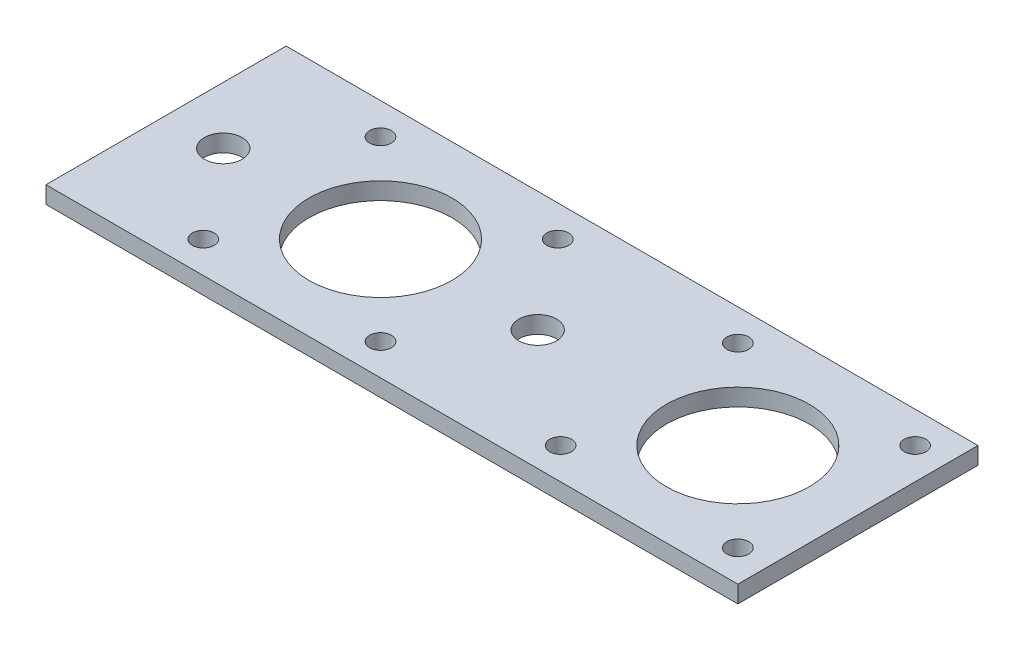
ISO-10303-21;
HEADER;
FILE_DESCRIPTION(('STEP AP214'),'2;1');
FILE_NAME('part.step','',(''),(''),'','','');
FILE_SCHEMA(('AUTOMOTIVE_DESIGN { 1 0 10303 214 1 1 1 1 }'));
ENDSEC;
DATA;
#1=APPLICATION_CONTEXT('core data for automotive mechanical design processes');
#2=APPLICATION_PROTOCOL_DEFINITION('international standard','automotive_design',2000,#1);
#3=PRODUCT_CONTEXT('',#1,'mechanical');
#4=PRODUCT('Part','Part','',(#3));
#5=PRODUCT_RELATED_PRODUCT_CATEGORY('part','',(#4));
#6=PRODUCT_DEFINITION_FORMATION('','',#4);
#7=PRODUCT_DEFINITION_CONTEXT('part definition',#1,'design');
#8=PRODUCT_DEFINITION('design','',#6,#7);
#9=PRODUCT_DEFINITION_SHAPE('','',#8);
#10=(LENGTH_UNIT() NAMED_UNIT(*) SI_UNIT(.MILLI.,.METRE.));
#11=(NAMED_UNIT(*) PLANE_ANGLE_UNIT() SI_UNIT($,.RADIAN.));
#12=(NAMED_UNIT(*) SI_UNIT($,.STERADIAN.) SOLID_ANGLE_UNIT());
#13=UNCERTAINTY_MEASURE_WITH_UNIT(LENGTH_MEASURE(1.E-05),#10,'distance_accuracy_value','');
#14=(GEOMETRIC_REPRESENTATION_CONTEXT(3) GLOBAL_UNCERTAINTY_ASSIGNED_CONTEXT((#13)) GLOBAL_UNIT_ASSIGNED_CONTEXT((#10,
#11,#12)) REPRESENTATION_CONTEXT('',''));
#15=CARTESIAN_POINT('',(0.,0.,0.));
#16=DIRECTION('',(0.,0.,1.));
#17=DIRECTION('',(1.,0.,0.));
#18=AXIS2_PLACEMENT_3D('',#15,#16,#17);
#19=CARTESIAN_POINT('',(0.,3.,0.));
#20=DIRECTION('',(0.,-1.,0.));
#21=DIRECTION('',(0.,0.,-1.));
#22=AXIS2_PLACEMENT_3D('',#19,#20,#21);
#23=PLANE('',#22);
#24=CARTESIAN_POINT('',(84.5,3.,-36.5));
#25=DIRECTION('',(0.,1.,0.));
#26=DIRECTION('',(0.,0.,1.));
#27=AXIS2_PLACEMENT_3D('',#24,#25,#26);
#28=CIRCLE('',#27,1.90000000000001);
#29=CARTESIAN_POINT('',(84.5,3.,-34.6));
#30=VERTEX_POINT('',#29);
#31=EDGE_CURVE('E240',#30,#30,#28,.T.);
#32=ORIENTED_EDGE('',*,*,#31,.F.);
#33=EDGE_LOOP('',(#32));
#34=FACE_BOUND('',#33,.T.);
#35=CARTESIAN_POINT('',(115.5,3.,-36.5));
#36=DIRECTION('',(0.,1.,0.));
#37=DIRECTION('',(0.,0.,1.));
#38=AXIS2_PLACEMENT_3D('',#35,#36,#37);
#39=CIRCLE('',#38,1.90000000000001);
#40=CARTESIAN_POINT('',(115.5,3.,-34.6));
#41=VERTEX_POINT('',#40);
#42=EDGE_CURVE('E248',#41,#41,#39,.T.);
#43=ORIENTED_EDGE('',*,*,#42,.F.);
#44=EDGE_LOOP('',(#43));
#45=FACE_BOUND('',#44,.T.);
#46=CARTESIAN_POINT('',(115.5,3.,-5.49999999999999));
#47=DIRECTION('',(0.,1.,0.));
#48=DIRECTION('',(0.,0.,1.));
#49=AXIS2_PLACEMENT_3D('',#46,#47,#48);
#50=CIRCLE('',#49,1.90000000000001);
#51=CARTESIAN_POINT('',(115.5,3.,-3.59999999999997));
#52=VERTEX_POINT('',#51);
#53=EDGE_CURVE('E254',#52,#52,#50,.T.);
#54=ORIENTED_EDGE('',*,*,#53,.F.);
#55=EDGE_LOOP('',(#54));
#56=FACE_BOUND('',#55,.T.);
#57=CARTESIAN_POINT('',(84.5,3.,-5.49999999999999));
#58=DIRECTION('',(0.,1.,0.));
#59=DIRECTION('',(0.,0.,1.));
#60=AXIS2_PLACEMENT_3D('',#57,#58,#59);
#61=CIRCLE('',#60,1.90000000000001);
#62=CARTESIAN_POINT('',(84.5,3.,-3.59999999999997));
#63=VERTEX_POINT('',#62);
#64=EDGE_CURVE('E106',#63,#63,#61,.T.);
#65=ORIENTED_EDGE('',*,*,#64,.F.);
#66=EDGE_LOOP('',(#65));
#67=FACE_BOUND('',#66,.T.);
#68=CARTESIAN_POINT('',(37.5,3.,-21.));
#69=DIRECTION('',(0.,1.,0.));
#70=DIRECTION('',(0.,0.,1.));
#71=AXIS2_PLACEMENT_3D('',#68,#69,#70);
#72=CIRCLE('',#71,12.5);
#73=CARTESIAN_POINT('',(37.5,3.,-8.49999999999998));
#74=VERTEX_POINT('',#73);
#75=EDGE_CURVE('E95',#74,#74,#72,.T.);
#76=ORIENTED_EDGE('',*,*,#75,.F.);
#77=EDGE_LOOP('',(#76));
#78=FACE_BOUND('',#77,.T.);
#79=CARTESIAN_POINT('',(53.,3.,-36.5));
#80=DIRECTION('',(0.,1.,0.));
#81=DIRECTION('',(0.,0.,1.));
#82=AXIS2_PLACEMENT_3D('',#79,#80,#81);
#83=CIRCLE('',#82,1.90000000000001);
#84=CARTESIAN_POINT('',(53.,3.,-34.6));
#85=VERTEX_POINT('',#84);
#86=EDGE_CURVE('E133',#85,#85,#83,.T.);
#87=ORIENTED_EDGE('',*,*,#86,.F.);
#88=EDGE_LOOP('',(#87));
#89=FACE_BOUND('',#88,.T.);
#90=CARTESIAN_POINT('',(53.,3.,-5.5));
#91=DIRECTION('',(0.,1.,0.));
#92=DIRECTION('',(0.,0.,1.));
#93=AXIS2_PLACEMENT_3D('',#90,#91,#92);
#94=CIRCLE('',#93,1.90000000000001);
#95=CARTESIAN_POINT('',(53.,3.,-3.59999999999998));
#96=VERTEX_POINT('',#95);
#97=EDGE_CURVE('E139',#96,#96,#94,.T.);
#98=ORIENTED_EDGE('',*,*,#97,.F.);
#99=EDGE_LOOP('',(#98));
#100=FACE_BOUND('',#99,.T.);
#101=CARTESIAN_POINT('',(22.,3.,-5.5));
#102=DIRECTION('',(0.,1.,0.));
#103=DIRECTION('',(0.,0.,1.));
#104=AXIS2_PLACEMENT_3D('',#101,#102,#103);
#105=CIRCLE('',#104,1.90000000000001);
#106=CARTESIAN_POINT('',(22.,3.,-3.59999999999998));
#107=VERTEX_POINT('',#106);
#108=EDGE_CURVE('E145',#107,#107,#105,.T.);
#109=ORIENTED_EDGE('',*,*,#108,.F.);
#110=EDGE_LOOP('',(#109));
#111=FACE_BOUND('',#110,.T.);
#112=DIRECTION('',(0.,0.,1.));
#113=VECTOR('',#112,1.);
#114=CARTESIAN_POINT('',(0.,3.,0.));
#115=LINE('',#114,#113);
#116=CARTESIAN_POINT('',(0.,3.,-42.));
#117=VERTEX_POINT('',#116);
#118=CARTESIAN_POINT('',(0.,3.,0.));
#119=VERTEX_POINT('',#118);
#120=EDGE_CURVE('E87',#117,#119,#115,.T.);
#121=ORIENTED_EDGE('',*,*,#120,.T.);
#122=DIRECTION('',(1.,0.,0.));
#123=VECTOR('',#122,1.);
#124=CARTESIAN_POINT('',(0.,3.,0.));
#125=LINE('',#124,#123);
#126=CARTESIAN_POINT('',(121.,3.,0.));
#127=VERTEX_POINT('',#126);
#128=EDGE_CURVE('E82',#119,#127,#125,.T.);
#129=ORIENTED_EDGE('',*,*,#128,.T.);
#130=DIRECTION('',(0.,0.,1.));
#131=VECTOR('',#130,1.);
#132=CARTESIAN_POINT('',(121.,3.,0.));
#133=LINE('',#132,#131);
#134=CARTESIAN_POINT('',(121.,3.,-42.));
#135=VERTEX_POINT('',#134);
#136=EDGE_CURVE('E85',#135,#127,#133,.T.);
#137=ORIENTED_EDGE('',*,*,#136,.F.);
#138=DIRECTION('',(-1.,0.,0.));
#139=VECTOR('',#138,1.);
#140=CARTESIAN_POINT('',(0.,3.,-42.));
#141=LINE('',#140,#139);
#142=EDGE_CURVE('E58',#135,#117,#141,.T.);
#143=ORIENTED_EDGE('',*,*,#142,.T.);
#144=EDGE_LOOP('',(#121,#129,#137,#143));
#145=FACE_BOUND('',#144,.T.);
#146=CARTESIAN_POINT('',(22.,3.,-36.5));
#147=DIRECTION('',(0.,1.,0.));
#148=DIRECTION('',(0.,0.,1.));
#149=AXIS2_PLACEMENT_3D('',#146,#147,#148);
#150=CIRCLE('',#149,1.90000000000001);
#151=CARTESIAN_POINT('',(22.,3.,-34.6));
#152=VERTEX_POINT('',#151);
#153=EDGE_CURVE('E127',#152,#152,#150,.T.);
#154=ORIENTED_EDGE('',*,*,#153,.F.);
#155=EDGE_LOOP('',(#154));
#156=FACE_BOUND('',#155,.T.);
#157=CARTESIAN_POINT('',(65.,3.,-21.));
#158=DIRECTION('',(0.,1.,0.));
#159=DIRECTION('',(0.,0.,1.));
#160=AXIS2_PLACEMENT_3D('',#157,#158,#159);
#161=CIRCLE('',#160,3.30000000000001);
#162=CARTESIAN_POINT('',(65.,3.,-17.7));
#163=VERTEX_POINT('',#162);
#164=EDGE_CURVE('E121',#163,#163,#161,.T.);
#165=ORIENTED_EDGE('',*,*,#164,.F.);
#166=EDGE_LOOP('',(#165));
#167=FACE_BOUND('',#166,.T.);
#168=CARTESIAN_POINT('',(10.,3.,-21.));
#169=DIRECTION('',(0.,1.,0.));
#170=DIRECTION('',(0.,0.,1.));
#171=AXIS2_PLACEMENT_3D('',#168,#169,#170);
#172=CIRCLE('',#171,3.30000000000001);
#173=CARTESIAN_POINT('',(10.,3.,-17.7));
#174=VERTEX_POINT('',#173);
#175=EDGE_CURVE('E115',#174,#174,#172,.T.);
#176=ORIENTED_EDGE('',*,*,#175,.F.);
#177=EDGE_LOOP('',(#176));
#178=FACE_BOUND('',#177,.T.);
#179=CARTESIAN_POINT('',(100.,3.,-21.));
#180=DIRECTION('',(0.,1.,0.));
#181=DIRECTION('',(0.,0.,1.));
#182=AXIS2_PLACEMENT_3D('',#179,#180,#181);
#183=CIRCLE('',#182,12.5);
#184=CARTESIAN_POINT('',(100.,3.,-8.49999999999998));
#185=VERTEX_POINT('',#184);
#186=EDGE_CURVE('E237',#185,#185,#183,.T.);
#187=ORIENTED_EDGE('',*,*,#186,.F.);
#188=EDGE_LOOP('',(#187));
#189=FACE_BOUND('',#188,.T.);
#190=ADVANCED_FACE('F41',(#34,#45,#56,#67,#78,#89,#100,#111,#145,#156,#167,#178,#189),#23,.F.);
#191=CARTESIAN_POINT('',(0.,3.,0.));
#192=DIRECTION('',(1.,0.,0.));
#193=DIRECTION('',(0.,0.,-1.));
#194=AXIS2_PLACEMENT_3D('',#191,#192,#193);
#195=PLANE('',#194);
#196=DIRECTION('',(0.,0.,1.));
#197=VECTOR('',#196,1.);
#198=CARTESIAN_POINT('',(0.,0.,0.));
#199=LINE('',#198,#197);
#200=CARTESIAN_POINT('',(0.,0.,-42.));
#201=VERTEX_POINT('',#200);
#202=CARTESIAN_POINT('',(0.,0.,0.));
#203=VERTEX_POINT('',#202);
#204=EDGE_CURVE('E151',#201,#203,#199,.T.);
#205=ORIENTED_EDGE('',*,*,#204,.T.);
#206=DIRECTION('',(0.,-1.,0.));
#207=VECTOR('',#206,1.);
#208=CARTESIAN_POINT('',(0.,3.,0.));
#209=LINE('',#208,#207);
#210=EDGE_CURVE('E11',#119,#203,#209,.T.);
#211=ORIENTED_EDGE('',*,*,#210,.F.);
#212=ORIENTED_EDGE('',*,*,#120,.F.);
#213=DIRECTION('',(0.,-1.,0.));
#214=VECTOR('',#213,1.);
#215=CARTESIAN_POINT('',(0.,3.,-42.));
#216=LINE('',#215,#214);
#217=EDGE_CURVE('E50',#117,#201,#216,.T.);
#218=ORIENTED_EDGE('',*,*,#217,.T.);
#219=EDGE_LOOP('',(#205,#211,#212,#218));
#220=FACE_BOUND('',#219,.T.);
#221=ADVANCED_FACE('F43',(#220),#195,.F.);
#222=CARTESIAN_POINT('',(0.,3.,0.));
#223=DIRECTION('',(0.,0.,-1.));
#224=DIRECTION('',(-1.,0.,0.));
#225=AXIS2_PLACEMENT_3D('',#222,#223,#224);
#226=PLANE('',#225);
#227=DIRECTION('',(1.,0.,0.));
#228=VECTOR('',#227,1.);
#229=CARTESIAN_POINT('',(0.,0.,0.));
#230=LINE('',#229,#228);
#231=CARTESIAN_POINT('',(121.,0.,0.));
#232=VERTEX_POINT('',#231);
#233=EDGE_CURVE('E70',#203,#232,#230,.T.);
#234=ORIENTED_EDGE('',*,*,#233,.T.);
#235=DIRECTION('',(0.,1.,0.));
#236=VECTOR('',#235,1.);
#237=CARTESIAN_POINT('',(121.,0.,0.));
#238=LINE('',#237,#236);
#239=EDGE_CURVE('E91',#232,#127,#238,.T.);
#240=ORIENTED_EDGE('',*,*,#239,.T.);
#241=ORIENTED_EDGE('',*,*,#128,.F.);
#242=ORIENTED_EDGE('',*,*,#210,.T.);
#243=EDGE_LOOP('',(#234,#240,#241,#242));
#244=FACE_BOUND('',#243,.T.);
#245=ADVANCED_FACE('F92',(#244),#226,.F.);
#246=CARTESIAN_POINT('',(0.,3.,-42.));
#247=DIRECTION('',(0.,0.,1.));
#248=DIRECTION('',(1.,0.,0.));
#249=AXIS2_PLACEMENT_3D('',#246,#247,#248);
#250=PLANE('',#249);
#251=DIRECTION('',(-1.,0.,0.));
#252=VECTOR('',#251,1.);
#253=CARTESIAN_POINT('',(0.,0.,-42.));
#254=LINE('',#253,#252);
#255=CARTESIAN_POINT('',(121.,0.,-42.));
#256=VERTEX_POINT('',#255);
#257=EDGE_CURVE('E152',#256,#201,#254,.T.);
#258=ORIENTED_EDGE('',*,*,#257,.T.);
#259=ORIENTED_EDGE('',*,*,#217,.F.);
#260=ORIENTED_EDGE('',*,*,#142,.F.);
#261=DIRECTION('',(0.,1.,0.));
#262=VECTOR('',#261,1.);
#263=CARTESIAN_POINT('',(121.,0.,-42.));
#264=LINE('',#263,#262);
#265=EDGE_CURVE('E96',#256,#135,#264,.T.);
#266=ORIENTED_EDGE('',*,*,#265,.F.);
#267=EDGE_LOOP('',(#258,#259,#260,#266));
#268=FACE_BOUND('',#267,.T.);
#269=ADVANCED_FACE('F162',(#268),#250,.F.);
#270=CARTESIAN_POINT('',(0.,0.,0.));
#271=DIRECTION('',(0.,-1.,0.));
#272=DIRECTION('',(0.,0.,-1.));
#273=AXIS2_PLACEMENT_3D('',#270,#271,#272);
#274=PLANE('',#273);
#275=CARTESIAN_POINT('',(100.,0.,-21.));
#276=DIRECTION('',(0.,1.,0.));
#277=DIRECTION('',(0.,0.,1.));
#278=AXIS2_PLACEMENT_3D('',#275,#276,#277);
#279=CIRCLE('',#278,12.5);
#280=CARTESIAN_POINT('',(100.,0.,-8.49999999999998));
#281=VERTEX_POINT('',#280);
#282=EDGE_CURVE('E234',#281,#281,#279,.T.);
#283=ORIENTED_EDGE('',*,*,#282,.T.);
#284=EDGE_LOOP('',(#283));
#285=FACE_BOUND('',#284,.T.);
#286=CARTESIAN_POINT('',(84.5,0.,-36.5));
#287=DIRECTION('',(0.,1.,0.));
#288=DIRECTION('',(0.,0.,1.));
#289=AXIS2_PLACEMENT_3D('',#286,#287,#288);
#290=CIRCLE('',#289,1.90000000000001);
#291=CARTESIAN_POINT('',(84.5,0.,-34.6));
#292=VERTEX_POINT('',#291);
#293=EDGE_CURVE('E245',#292,#292,#290,.T.);
#294=ORIENTED_EDGE('',*,*,#293,.T.);
#295=EDGE_LOOP('',(#294));
#296=FACE_BOUND('',#295,.T.);
#297=CARTESIAN_POINT('',(115.5,0.,-36.5));
#298=DIRECTION('',(0.,1.,0.));
#299=DIRECTION('',(0.,0.,1.));
#300=AXIS2_PLACEMENT_3D('',#297,#298,#299);
#301=CIRCLE('',#300,1.90000000000001);
#302=CARTESIAN_POINT('',(115.5,0.,-34.6));
#303=VERTEX_POINT('',#302);
#304=EDGE_CURVE('E251',#303,#303,#301,.T.);
#305=ORIENTED_EDGE('',*,*,#304,.T.);
#306=EDGE_LOOP('',(#305));
#307=FACE_BOUND('',#306,.T.);
#308=CARTESIAN_POINT('',(115.5,0.,-5.49999999999999));
#309=DIRECTION('',(0.,1.,0.));
#310=DIRECTION('',(0.,0.,1.));
#311=AXIS2_PLACEMENT_3D('',#308,#309,#310);
#312=CIRCLE('',#311,1.90000000000001);
#313=CARTESIAN_POINT('',(115.5,0.,-3.59999999999997));
#314=VERTEX_POINT('',#313);
#315=EDGE_CURVE('E257',#314,#314,#312,.T.);
#316=ORIENTED_EDGE('',*,*,#315,.T.);
#317=EDGE_LOOP('',(#316));
#318=FACE_BOUND('',#317,.T.);
#319=CARTESIAN_POINT('',(84.5,0.,-5.49999999999999));
#320=DIRECTION('',(0.,1.,0.));
#321=DIRECTION('',(0.,0.,1.));
#322=AXIS2_PLACEMENT_3D('',#319,#320,#321);
#323=CIRCLE('',#322,1.90000000000001);
#324=CARTESIAN_POINT('',(84.5,0.,-3.59999999999997));
#325=VERTEX_POINT('',#324);
#326=EDGE_CURVE('E102',#325,#325,#323,.T.);
#327=ORIENTED_EDGE('',*,*,#326,.T.);
#328=EDGE_LOOP('',(#327));
#329=FACE_BOUND('',#328,.T.);
#330=CARTESIAN_POINT('',(37.5,0.,-21.));
#331=DIRECTION('',(0.,-1.,0.));
#332=DIRECTION('',(0.,0.,-1.));
#333=AXIS2_PLACEMENT_3D('',#330,#331,#332);
#334=CIRCLE('',#333,12.5);
#335=CARTESIAN_POINT('',(37.5,0.,-33.5));
#336=VERTEX_POINT('',#335);
#337=EDGE_CURVE('E112',#336,#336,#334,.T.);
#338=ORIENTED_EDGE('',*,*,#337,.F.);
#339=EDGE_LOOP('',(#338));
#340=FACE_BOUND('',#339,.T.);
#341=CARTESIAN_POINT('',(10.,0.,-21.));
#342=DIRECTION('',(0.,-1.,0.));
#343=DIRECTION('',(0.,0.,-1.));
#344=AXIS2_PLACEMENT_3D('',#341,#342,#343);
#345=CIRCLE('',#344,3.30000000000001);
#346=CARTESIAN_POINT('',(10.,0.,-24.3));
#347=VERTEX_POINT('',#346);
#348=EDGE_CURVE('E118',#347,#347,#345,.T.);
#349=ORIENTED_EDGE('',*,*,#348,.F.);
#350=EDGE_LOOP('',(#349));
#351=FACE_BOUND('',#350,.T.);
#352=CARTESIAN_POINT('',(65.,0.,-21.));
#353=DIRECTION('',(0.,-1.,0.));
#354=DIRECTION('',(0.,0.,-1.));
#355=AXIS2_PLACEMENT_3D('',#352,#353,#354);
#356=CIRCLE('',#355,3.30000000000001);
#357=CARTESIAN_POINT('',(65.,0.,-24.3));
#358=VERTEX_POINT('',#357);
#359=EDGE_CURVE('E124',#358,#358,#356,.T.);
#360=ORIENTED_EDGE('',*,*,#359,.F.);
#361=EDGE_LOOP('',(#360));
#362=FACE_BOUND('',#361,.T.);
#363=CARTESIAN_POINT('',(22.,0.,-36.5));
#364=DIRECTION('',(0.,-1.,0.));
#365=DIRECTION('',(0.,0.,-1.));
#366=AXIS2_PLACEMENT_3D('',#363,#364,#365);
#367=CIRCLE('',#366,1.90000000000001);
#368=CARTESIAN_POINT('',(22.,0.,-38.4));
#369=VERTEX_POINT('',#368);
#370=EDGE_CURVE('E130',#369,#369,#367,.T.);
#371=ORIENTED_EDGE('',*,*,#370,.F.);
#372=EDGE_LOOP('',(#371));
#373=FACE_BOUND('',#372,.T.);
#374=CARTESIAN_POINT('',(53.,0.,-36.5));
#375=DIRECTION('',(0.,-1.,0.));
#376=DIRECTION('',(0.,0.,-1.));
#377=AXIS2_PLACEMENT_3D('',#374,#375,#376);
#378=CIRCLE('',#377,1.90000000000001);
#379=CARTESIAN_POINT('',(53.,0.,-38.4));
#380=VERTEX_POINT('',#379);
#381=EDGE_CURVE('E136',#380,#380,#378,.T.);
#382=ORIENTED_EDGE('',*,*,#381,.F.);
#383=EDGE_LOOP('',(#382));
#384=FACE_BOUND('',#383,.T.);
#385=CARTESIAN_POINT('',(53.,0.,-5.5));
#386=DIRECTION('',(0.,-1.,0.));
#387=DIRECTION('',(0.,0.,-1.));
#388=AXIS2_PLACEMENT_3D('',#385,#386,#387);
#389=CIRCLE('',#388,1.90000000000001);
#390=CARTESIAN_POINT('',(53.,0.,-7.40000000000001));
#391=VERTEX_POINT('',#390);
#392=EDGE_CURVE('E142',#391,#391,#389,.T.);
#393=ORIENTED_EDGE('',*,*,#392,.F.);
#394=EDGE_LOOP('',(#393));
#395=FACE_BOUND('',#394,.T.);
#396=CARTESIAN_POINT('',(22.,0.,-5.5));
#397=DIRECTION('',(0.,-1.,0.));
#398=DIRECTION('',(0.,0.,-1.));
#399=AXIS2_PLACEMENT_3D('',#396,#397,#398);
#400=CIRCLE('',#399,1.90000000000001);
#401=CARTESIAN_POINT('',(22.,0.,-7.40000000000001));
#402=VERTEX_POINT('',#401);
#403=EDGE_CURVE('E148',#402,#402,#400,.T.);
#404=ORIENTED_EDGE('',*,*,#403,.F.);
#405=EDGE_LOOP('',(#404));
#406=FACE_BOUND('',#405,.T.);
#407=ORIENTED_EDGE('',*,*,#204,.F.);
#408=ORIENTED_EDGE('',*,*,#257,.F.);
#409=DIRECTION('',(0.,0.,1.));
#410=VECTOR('',#409,1.);
#411=CARTESIAN_POINT('',(121.,0.,0.));
#412=LINE('',#411,#410);
#413=EDGE_CURVE('E101',#256,#232,#412,.T.);
#414=ORIENTED_EDGE('',*,*,#413,.T.);
#415=ORIENTED_EDGE('',*,*,#233,.F.);
#416=EDGE_LOOP('',(#407,#408,#414,#415));
#417=FACE_BOUND('',#416,.T.);
#418=ADVANCED_FACE('F161',(#285,#296,#307,#318,#329,#340,#351,#362,#373,#384,#395,#406,#417),
#274,.T.);
#419=CARTESIAN_POINT('',(22.,3.,-5.5));
#420=DIRECTION('',(0.,1.,0.));
#421=DIRECTION('',(0.,0.,1.));
#422=AXIS2_PLACEMENT_3D('',#419,#420,#421);
#423=CYLINDRICAL_SURFACE('',#422,1.90000000000001);
#424=ORIENTED_EDGE('',*,*,#108,.T.);
#425=EDGE_LOOP('',(#424));
#426=FACE_BOUND('',#425,.T.);
#427=ORIENTED_EDGE('',*,*,#403,.T.);
#428=EDGE_LOOP('',(#427));
#429=FACE_BOUND('',#428,.T.);
#430=ADVANCED_FACE('F170',(#426,#429),#423,.F.);
#431=CARTESIAN_POINT('',(53.,3.,-5.5));
#432=DIRECTION('',(0.,1.,0.));
#433=DIRECTION('',(0.,0.,1.));
#434=AXIS2_PLACEMENT_3D('',#431,#432,#433);
#435=CYLINDRICAL_SURFACE('',#434,1.90000000000001);
#436=ORIENTED_EDGE('',*,*,#97,.T.);
#437=EDGE_LOOP('',(#436));
#438=FACE_BOUND('',#437,.T.);
#439=ORIENTED_EDGE('',*,*,#392,.T.);
#440=EDGE_LOOP('',(#439));
#441=FACE_BOUND('',#440,.T.);
#442=ADVANCED_FACE('F185',(#438,#441),#435,.F.);
#443=CARTESIAN_POINT('',(53.,3.,-36.5));
#444=DIRECTION('',(0.,1.,0.));
#445=DIRECTION('',(0.,0.,1.));
#446=AXIS2_PLACEMENT_3D('',#443,#444,#445);
#447=CYLINDRICAL_SURFACE('',#446,1.90000000000001);
#448=ORIENTED_EDGE('',*,*,#86,.T.);
#449=EDGE_LOOP('',(#448));
#450=FACE_BOUND('',#449,.T.);
#451=ORIENTED_EDGE('',*,*,#381,.T.);
#452=EDGE_LOOP('',(#451));
#453=FACE_BOUND('',#452,.T.);
#454=ADVANCED_FACE('F189',(#450,#453),#447,.F.);
#455=CARTESIAN_POINT('',(22.,3.,-36.5));
#456=DIRECTION('',(0.,1.,0.));
#457=DIRECTION('',(0.,0.,1.));
#458=AXIS2_PLACEMENT_3D('',#455,#456,#457);
#459=CYLINDRICAL_SURFACE('',#458,1.90000000000001);
#460=ORIENTED_EDGE('',*,*,#153,.T.);
#461=EDGE_LOOP('',(#460));
#462=FACE_BOUND('',#461,.T.);
#463=ORIENTED_EDGE('',*,*,#370,.T.);
#464=EDGE_LOOP('',(#463));
#465=FACE_BOUND('',#464,.T.);
#466=ADVANCED_FACE('F193',(#462,#465),#459,.F.);
#467=CARTESIAN_POINT('',(65.,3.,-21.));
#468=DIRECTION('',(0.,1.,0.));
#469=DIRECTION('',(0.,0.,1.));
#470=AXIS2_PLACEMENT_3D('',#467,#468,#469);
#471=CYLINDRICAL_SURFACE('',#470,3.30000000000001);
#472=ORIENTED_EDGE('',*,*,#164,.T.);
#473=EDGE_LOOP('',(#472));
#474=FACE_BOUND('',#473,.T.);
#475=ORIENTED_EDGE('',*,*,#359,.T.);
#476=EDGE_LOOP('',(#475));
#477=FACE_BOUND('',#476,.T.);
#478=ADVANCED_FACE('F197',(#474,#477),#471,.F.);
#479=CARTESIAN_POINT('',(10.,3.,-21.));
#480=DIRECTION('',(0.,1.,0.));
#481=DIRECTION('',(0.,0.,1.));
#482=AXIS2_PLACEMENT_3D('',#479,#480,#481);
#483=CYLINDRICAL_SURFACE('',#482,3.30000000000001);
#484=ORIENTED_EDGE('',*,*,#175,.T.);
#485=EDGE_LOOP('',(#484));
#486=FACE_BOUND('',#485,.T.);
#487=ORIENTED_EDGE('',*,*,#348,.T.);
#488=EDGE_LOOP('',(#487));
#489=FACE_BOUND('',#488,.T.);
#490=ADVANCED_FACE('F201',(#486,#489),#483,.F.);
#491=CARTESIAN_POINT('',(37.5,3.,-21.));
#492=DIRECTION('',(0.,1.,0.));
#493=DIRECTION('',(0.,0.,1.));
#494=AXIS2_PLACEMENT_3D('',#491,#492,#493);
#495=CYLINDRICAL_SURFACE('',#494,12.5);
#496=ORIENTED_EDGE('',*,*,#75,.T.);
#497=EDGE_LOOP('',(#496));
#498=FACE_BOUND('',#497,.T.);
#499=ORIENTED_EDGE('',*,*,#337,.T.);
#500=EDGE_LOOP('',(#499));
#501=FACE_BOUND('',#500,.T.);
#502=ADVANCED_FACE('F205',(#498,#501),#495,.F.);
#503=CARTESIAN_POINT('',(121.,0.,0.));
#504=DIRECTION('',(-1.,0.,0.));
#505=DIRECTION('',(0.,0.,1.));
#506=AXIS2_PLACEMENT_3D('',#503,#504,#505);
#507=PLANE('',#506);
#508=ORIENTED_EDGE('',*,*,#136,.T.);
#509=ORIENTED_EDGE('',*,*,#239,.F.);
#510=ORIENTED_EDGE('',*,*,#413,.F.);
#511=ORIENTED_EDGE('',*,*,#265,.T.);
#512=EDGE_LOOP('',(#508,#509,#510,#511));
#513=FACE_BOUND('',#512,.T.);
#514=ADVANCED_FACE('F99',(#513),#507,.F.);
#515=CARTESIAN_POINT('',(84.5,3.,-5.49999999999999));
#516=DIRECTION('',(0.,1.,0.));
#517=DIRECTION('',(0.,0.,1.));
#518=AXIS2_PLACEMENT_3D('',#515,#516,#517);
#519=CYLINDRICAL_SURFACE('',#518,1.90000000000001);
#520=ORIENTED_EDGE('',*,*,#326,.F.);
#521=EDGE_LOOP('',(#520));
#522=FACE_BOUND('',#521,.T.);
#523=ORIENTED_EDGE('',*,*,#64,.T.);
#524=EDGE_LOOP('',(#523));
#525=FACE_BOUND('',#524,.T.);
#526=ADVANCED_FACE('F211',(#522,#525),#519,.F.);
#527=CARTESIAN_POINT('',(115.5,3.,-5.49999999999999));
#528=DIRECTION('',(0.,1.,0.));
#529=DIRECTION('',(0.,0.,1.));
#530=AXIS2_PLACEMENT_3D('',#527,#528,#529);
#531=CYLINDRICAL_SURFACE('',#530,1.90000000000001);
#532=ORIENTED_EDGE('',*,*,#315,.F.);
#533=EDGE_LOOP('',(#532));
#534=FACE_BOUND('',#533,.T.);
#535=ORIENTED_EDGE('',*,*,#53,.T.);
#536=EDGE_LOOP('',(#535));
#537=FACE_BOUND('',#536,.T.);
#538=ADVANCED_FACE('F214',(#534,#537),#531,.F.);
#539=CARTESIAN_POINT('',(115.5,3.,-36.5));
#540=DIRECTION('',(0.,1.,0.));
#541=DIRECTION('',(0.,0.,1.));
#542=AXIS2_PLACEMENT_3D('',#539,#540,#541);
#543=CYLINDRICAL_SURFACE('',#542,1.90000000000001);
#544=ORIENTED_EDGE('',*,*,#304,.F.);
#545=EDGE_LOOP('',(#544));
#546=FACE_BOUND('',#545,.T.);
#547=ORIENTED_EDGE('',*,*,#42,.T.);
#548=EDGE_LOOP('',(#547));
#549=FACE_BOUND('',#548,.T.);
#550=ADVANCED_FACE('F218',(#546,#549),#543,.F.);
#551=CARTESIAN_POINT('',(84.5,3.,-36.5));
#552=DIRECTION('',(0.,1.,0.));
#553=DIRECTION('',(0.,0.,1.));
#554=AXIS2_PLACEMENT_3D('',#551,#552,#553);
#555=CYLINDRICAL_SURFACE('',#554,1.90000000000001);
#556=ORIENTED_EDGE('',*,*,#293,.F.);
#557=EDGE_LOOP('',(#556));
#558=FACE_BOUND('',#557,.T.);
#559=ORIENTED_EDGE('',*,*,#31,.T.);
#560=EDGE_LOOP('',(#559));
#561=FACE_BOUND('',#560,.T.);
#562=ADVANCED_FACE('F222',(#558,#561),#555,.F.);
#563=CARTESIAN_POINT('',(100.,3.,-21.));
#564=DIRECTION('',(0.,1.,0.));
#565=DIRECTION('',(0.,0.,1.));
#566=AXIS2_PLACEMENT_3D('',#563,#564,#565);
#567=CYLINDRICAL_SURFACE('',#566,12.5);
#568=ORIENTED_EDGE('',*,*,#282,.F.);
#569=EDGE_LOOP('',(#568));
#570=FACE_BOUND('',#569,.T.);
#571=ORIENTED_EDGE('',*,*,#186,.T.);
#572=EDGE_LOOP('',(#571));
#573=FACE_BOUND('',#572,.T.);
#574=ADVANCED_FACE('F225',(#570,#573),#567,.F.);
#575=CLOSED_SHELL('',(#190,#221,#245,#269,#418,#430,#442,#454,#466,#478,#490,#502,#514,#526,
#538,#550,#562,#574));
#576=MANIFOLD_SOLID_BREP('B2',#575);
#577=ADVANCED_BREP_SHAPE_REPRESENTATION('',(#18,#576),#14);
#578=SHAPE_DEFINITION_REPRESENTATION(#9,#577);
ENDSEC;
END-ISO-10303-21;
